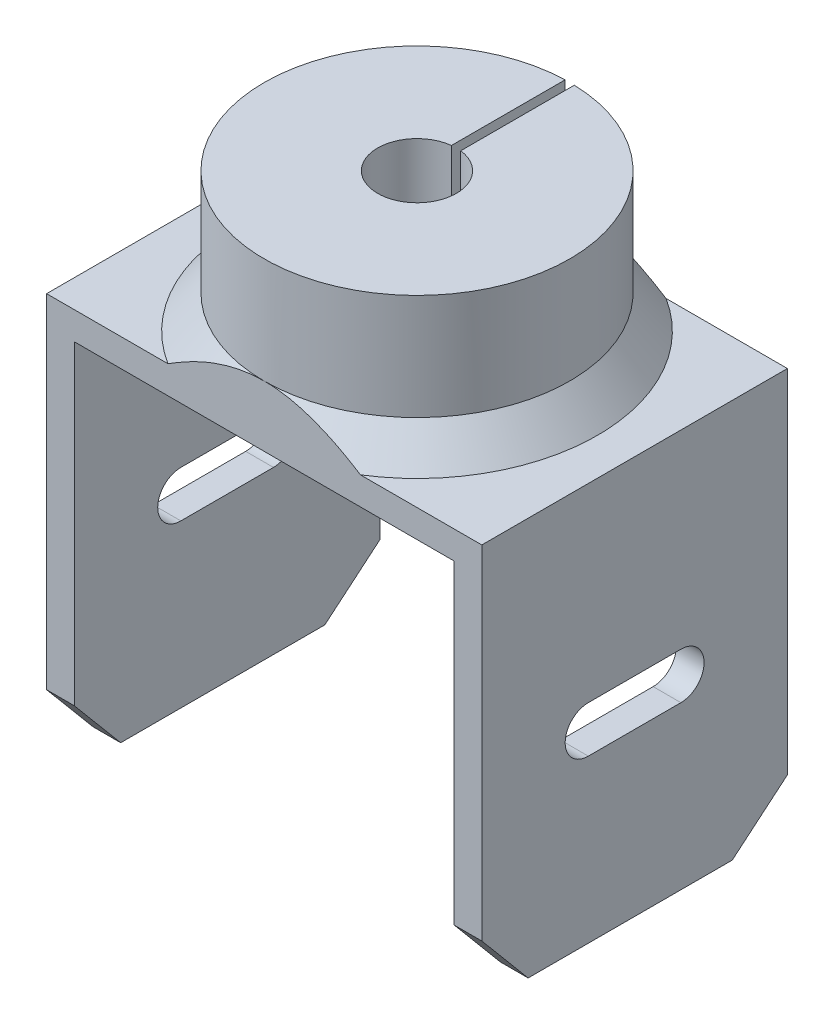
ISO-10303-21;
HEADER;
FILE_DESCRIPTION(('STEP AP214'),'2;1');
FILE_NAME('part.step','',(''),(''),'','','');
FILE_SCHEMA(('AUTOMOTIVE_DESIGN { 1 0 10303 214 1 1 1 1 }'));
ENDSEC;
DATA;
#1=APPLICATION_CONTEXT('core data for automotive mechanical design processes');
#2=APPLICATION_PROTOCOL_DEFINITION('international standard','automotive_design',2000,#1);
#3=PRODUCT_CONTEXT('',#1,'mechanical');
#4=PRODUCT('Part','Part','',(#3));
#5=PRODUCT_RELATED_PRODUCT_CATEGORY('part','',(#4));
#6=PRODUCT_DEFINITION_FORMATION('','',#4);
#7=PRODUCT_DEFINITION_CONTEXT('part definition',#1,'design');
#8=PRODUCT_DEFINITION('design','',#6,#7);
#9=PRODUCT_DEFINITION_SHAPE('','',#8);
#10=(LENGTH_UNIT() NAMED_UNIT(*) SI_UNIT(.MILLI.,.METRE.));
#11=(NAMED_UNIT(*) PLANE_ANGLE_UNIT() SI_UNIT($,.RADIAN.));
#12=(NAMED_UNIT(*) SI_UNIT($,.STERADIAN.) SOLID_ANGLE_UNIT());
#13=UNCERTAINTY_MEASURE_WITH_UNIT(LENGTH_MEASURE(1.E-05),#10,'distance_accuracy_value','');
#14=(GEOMETRIC_REPRESENTATION_CONTEXT(3) GLOBAL_UNCERTAINTY_ASSIGNED_CONTEXT((#13)) GLOBAL_UNIT_ASSIGNED_CONTEXT((#10,
#11,#12)) REPRESENTATION_CONTEXT('',''));
#15=CARTESIAN_POINT('',(0.,0.,0.));
#16=DIRECTION('',(0.,0.,1.));
#17=DIRECTION('',(1.,0.,0.));
#18=AXIS2_PLACEMENT_3D('',#15,#16,#17);
#19=CARTESIAN_POINT('',(20.5,46.5752607777827,16.5));
#20=DIRECTION('',(0.,-1.,0.));
#21=DIRECTION('',(0.,0.,-1.));
#22=AXIS2_PLACEMENT_3D('',#19,#20,#21);
#23=CONICAL_SURFACE('',#22,16.5,0.698131700797727);
#24=CARTESIAN_POINT('',(20.,31.1235858784582,-12.9612521534924));
#25=CARTESIAN_POINT('',(20.,32.4082386581928,-11.8831437303844));
#26=CARTESIAN_POINT('',(20.,33.6928844605559,-10.8050269927722));
#27=CARTESIAN_POINT('',(20.,36.2621518242112,-8.64876480954999));
#28=CARTESIAN_POINT('',(20.,37.5467733855051,-7.5706193639419));
#29=CARTESIAN_POINT('',(20.,40.1159818837572,-5.41428776711653));
#30=CARTESIAN_POINT('',(20.,41.4005688207225,-4.33610161590785));
#31=CARTESIAN_POINT('',(20.,43.9696882564792,-2.1796642860111));
#32=CARTESIAN_POINT('',(20.,45.2542207552669,-1.10141310731876));
#33=CARTESIAN_POINT('',(20.,47.8231957486794,1.0551975488786));
#34=CARTESIAN_POINT('',(20.,49.1076382432667,2.13355702642822));
#35=CARTESIAN_POINT('',(20.,51.034169306314,3.75125399468718));
#36=CARTESIAN_POINT('',(20.,51.6763241504041,4.2905125558501));
#37=CARTESIAN_POINT('',(20.,52.9605675644327,5.36910868972706));
#38=CARTESIAN_POINT('',(20.,53.6026561343662,5.90844626244701));
#39=CARTESIAN_POINT('',(20.,54.8867304456449,6.98724464832452));
#40=CARTESIAN_POINT('',(20.,55.5287161869234,7.52670546156154));
#41=CARTESIAN_POINT('',(20.,56.8125167209691,8.60583022162086));
#42=CARTESIAN_POINT('',(20.,57.4543315137728,9.14549416839975));
#43=CARTESIAN_POINT('',(20.,58.4168092218042,9.95528129906022));
#44=CARTESIAN_POINT('',(20.,58.7375945246768,10.2252590015758));
#45=CARTESIAN_POINT('',(20.,59.3790417376693,10.7653608434587));
#46=CARTESIAN_POINT('',(20.,59.6997036478092,11.0354849828024));
#47=CARTESIAN_POINT('',(20.,60.3408473156922,11.575947628918));
#48=CARTESIAN_POINT('',(20.,60.6613290732863,11.8462861358666));
#49=CARTESIAN_POINT('',(20.,61.3019644169624,12.3873520228227));
#50=CARTESIAN_POINT('',(20.,61.6221180028517,12.6580794030584));
#51=CARTESIAN_POINT('',(20.,61.9420334373806,12.9290884254426));
#52=B_SPLINE_CURVE_WITH_KNOTS('',3,(#24,#25,#26,#27,#28,#29,#30,#31,#32,#33,#34,#35,#36,#37,#38,
#39,#40,#41,#42,#43,#44,#45,#46,#47,#48,#49,#50,#51),.UNSPECIFIED.,.F.,.F.,(4,2,2,2,2,2,2,2,2,2,
2,2,2,4),(0.,5.03128759179536,10.0625748440544,15.09386103754,20.1251475613957,25.1564361650056,
27.6720799669897,30.1877239570945,32.7033695736349,35.2190146528186,36.4768383461005,
37.7346618352053,38.9924863621584,40.250311627848),.UNSPECIFIED.);
#53=CARTESIAN_POINT('',(20.0000000000008,46.5662344131679,0.));
#54=VERTEX_POINT('',#53);
#55=CARTESIAN_POINT('',(20.,46.5752607777827,0.00757749752935572));
#56=VERTEX_POINT('',#55);
#57=EDGE_CURVE('E417',#54,#56,#52,.T.);
#58=ORIENTED_EDGE('',*,*,#57,.F.);
#59=CARTESIAN_POINT('',(10.1076951545867,43.,0.));
#60=CARTESIAN_POINT('',(10.3713029475647,43.1674025231381,0.));
#61=CARTESIAN_POINT('',(10.6369767958303,43.3316015660541,0.));
#62=CARTESIAN_POINT('',(11.1728436984879,43.6526508913293,0.));
#63=CARTESIAN_POINT('',(11.4430382351766,43.8094986965571,0.));
#64=CARTESIAN_POINT('',(11.9894137016226,44.1154938605991,0.));
#65=CARTESIAN_POINT('',(12.2656164811726,44.26460240082,0.));
#66=CARTESIAN_POINT('',(12.8230054590707,44.553102300888,0.));
#67=CARTESIAN_POINT('',(13.1041911530497,44.6924946372394,0.));
#68=CARTESIAN_POINT('',(13.9383858209299,45.0860198222011,0.));
#69=CARTESIAN_POINT('',(14.4987060249486,45.3249868541375,0.));
#70=CARTESIAN_POINT('',(15.6384232778204,45.7495789928983,0.));
#71=CARTESIAN_POINT('',(16.2177802751166,45.9353089833988,0.));
#72=CARTESIAN_POINT('',(17.1045913482349,46.1662485176849,0.));
#73=CARTESIAN_POINT('',(17.4058204063377,46.2356695361382,0.));
#74=CARTESIAN_POINT('',(18.0119671429305,46.3561486345492,0.));
#75=CARTESIAN_POINT('',(18.3168848188276,46.4072067274141,0.));
#76=CARTESIAN_POINT('',(18.9340202305861,46.4903266759053,0.));
#77=CARTESIAN_POINT('',(19.2462787295583,46.5220906573194,0.));
#78=CARTESIAN_POINT('',(19.7157712090069,46.5539455814985,0.));
#79=CARTESIAN_POINT('',(19.8725019728392,46.561932073572,0.));
#80=CARTESIAN_POINT('',(20.1861510318667,46.5725919239759,0.));
#81=CARTESIAN_POINT('',(20.3430693352848,46.5752650400884,0.));
#82=CARTESIAN_POINT('',(20.5,46.5752607777827,0.));
#83=B_SPLINE_CURVE_WITH_KNOTS('',3,(#59,#60,#61,#62,#63,#64,#65,#66,#67,#68,#69,#70,#71,#72,#73,
#74,#75,#76,#77,#78,#79,#80,#81,#82),.UNSPECIFIED.,.F.,.F.,(4,2,2,2,2,2,2,2,2,2,2,4),(0.,
0.936825624137657,1.87396469166485,2.81542255533145,3.756785663154,5.5821015813017,
7.40379628407125,8.33068705331386,9.2575771710448,10.1984357654159,10.6691593428868,
11.1399043784784),.UNSPECIFIED.);
#84=CARTESIAN_POINT('',(10.1076951545867,43.,0.));
#85=VERTEX_POINT('',#84);
#86=EDGE_CURVE('E389',#85,#54,#83,.T.);
#87=ORIENTED_EDGE('',*,*,#86,.F.);
#88=CARTESIAN_POINT('',(20.5,43.,16.5));
#89=DIRECTION('',(0.,-1.,0.));
#90=DIRECTION('',(0.,0.,-1.));
#91=AXIS2_PLACEMENT_3D('',#88,#89,#90);
#92=CIRCLE('',#91,19.5);
#93=CARTESIAN_POINT('',(10.1076951545867,43.,33.));
#94=VERTEX_POINT('',#93);
#95=EDGE_CURVE('E377',#94,#85,#92,.T.);
#96=ORIENTED_EDGE('',*,*,#95,.F.);
#97=CARTESIAN_POINT('',(20.5,46.5752607777827,33.));
#98=CARTESIAN_POINT('',(20.284187533117,46.575283673132,33.));
#99=CARTESIAN_POINT('',(20.0683831516863,46.5702153896589,33.));
#100=CARTESIAN_POINT('',(19.6372729182324,46.5500666405771,33.));
#101=CARTESIAN_POINT('',(19.4219669976472,46.534987645521,33.));
#102=CARTESIAN_POINT('',(18.99265426695,46.4950231050673,33.));
#103=CARTESIAN_POINT('',(18.7786458279619,46.4701550378579,33.));
#104=CARTESIAN_POINT('',(18.3519552062854,46.4109374446163,33.));
#105=CARTESIAN_POINT('',(18.1392730600473,46.3765876591646,33.));
#106=CARTESIAN_POINT('',(17.5115826635059,46.2613366966163,33.));
#107=CARTESIAN_POINT('',(17.0989011397188,46.1674550195782,33.));
#108=CARTESIAN_POINT('',(16.2819239862643,45.9484414137886,33.));
#109=CARTESIAN_POINT('',(15.8776314486593,45.8232981765294,33.));
#110=CARTESIAN_POINT('',(15.0096600170661,45.5221084576806,33.));
#111=CARTESIAN_POINT('',(14.5477426058939,45.3410073492915,33.));
#112=CARTESIAN_POINT('',(13.637034951159,44.9481285605995,33.));
#113=CARTESIAN_POINT('',(13.1882517450428,44.7363347838778,33.));
#114=CARTESIAN_POINT('',(12.2931774421302,44.2826407364062,33.));
#115=CARTESIAN_POINT('',(11.8471832168154,44.0401581709657,33.));
#116=CARTESIAN_POINT('',(11.1877662131576,43.6608648180069,33.));
#117=CARTESIAN_POINT('',(10.9697364722435,43.5319542689151,33.));
#118=CARTESIAN_POINT('',(10.5365873757278,43.2694043515296,33.));
#119=CARTESIAN_POINT('',(10.321467570923,43.1357657248892,33.));
#120=CARTESIAN_POINT('',(10.1076951545867,43.,33.));
#121=B_SPLINE_CURVE_WITH_KNOTS('',3,(#97,#98,#99,#100,#101,#102,#103,#104,#105,#106,#107,#108,
#109,#110,#111,#112,#113,#114,#115,#116,#117,#118,#119,#120),.UNSPECIFIED.,.F.,.F.,(4,2,2,2,2,2,
2,2,2,2,2,4),(0.,0.647364404019486,1.29463373259782,1.9407525791622,2.5868891052842,
3.85504288283706,5.12365606633128,6.61071477164996,8.09855618925469,9.62075575901222,
10.3805725269616,11.1402706328046),.UNSPECIFIED.);
#122=CARTESIAN_POINT('',(20.5,46.5752607777827,33.));
#123=VERTEX_POINT('',#122);
#124=EDGE_CURVE('E382',#123,#94,#121,.T.);
#125=ORIENTED_EDGE('',*,*,#124,.F.);
#126=CARTESIAN_POINT('',(20.5,46.5752607777827,16.5));
#127=DIRECTION('',(0.,-1.,0.));
#128=DIRECTION('',(0.,0.,-1.));
#129=AXIS2_PLACEMENT_3D('',#126,#127,#128);
#130=CIRCLE('',#129,16.5);
#131=EDGE_CURVE('E375',#56,#123,#130,.F.);
#132=ORIENTED_EDGE('',*,*,#131,.F.);
#133=EDGE_LOOP('',(#58,#87,#96,#125,#132));
#134=FACE_BOUND('',#133,.T.);
#135=ADVANCED_FACE('F33',(#134),#23,.T.);
#136=CARTESIAN_POINT('',(-3.,43.,33.));
#137=DIRECTION('',(0.,-1.,0.));
#138=DIRECTION('',(0.,0.,-1.));
#139=AXIS2_PLACEMENT_3D('',#136,#137,#138);
#140=PLANE('',#139);
#141=DIRECTION('',(-1.,0.,0.));
#142=VECTOR('',#141,1.);
#143=CARTESIAN_POINT('',(-3.,43.,0.));
#144=LINE('',#143,#142);
#145=CARTESIAN_POINT('',(44.,43.,0.));
#146=VERTEX_POINT('',#145);
#147=CARTESIAN_POINT('',(30.8923048454133,43.,0.));
#148=VERTEX_POINT('',#147);
#149=EDGE_CURVE('E346',#146,#148,#144,.T.);
#150=ORIENTED_EDGE('',*,*,#149,.T.);
#151=CARTESIAN_POINT('',(20.5,43.,16.5));
#152=DIRECTION('',(0.,-1.,0.));
#153=DIRECTION('',(0.,0.,-1.));
#154=AXIS2_PLACEMENT_3D('',#151,#152,#153);
#155=CIRCLE('',#154,19.5);
#156=CARTESIAN_POINT('',(30.8923048454133,43.,33.));
#157=VERTEX_POINT('',#156);
#158=EDGE_CURVE('E380',#148,#157,#155,.T.);
#159=ORIENTED_EDGE('',*,*,#158,.T.);
#160=DIRECTION('',(-1.,0.,0.));
#161=VECTOR('',#160,1.);
#162=CARTESIAN_POINT('',(-3.,43.,33.));
#163=LINE('',#162,#161);
#164=CARTESIAN_POINT('',(44.,43.,33.));
#165=VERTEX_POINT('',#164);
#166=EDGE_CURVE('E330',#165,#157,#163,.T.);
#167=ORIENTED_EDGE('',*,*,#166,.F.);
#168=DIRECTION('',(0.,0.,-1.));
#169=VECTOR('',#168,1.);
#170=CARTESIAN_POINT('',(44.,43.,33.));
#171=LINE('',#170,#169);
#172=EDGE_CURVE('E354',#165,#146,#171,.T.);
#173=ORIENTED_EDGE('',*,*,#172,.T.);
#174=EDGE_LOOP('',(#150,#159,#167,#173));
#175=FACE_BOUND('',#174,.T.);
#176=ADVANCED_FACE('F482',(#175),#140,.F.);
#177=CARTESIAN_POINT('',(-3.,0.,33.));
#178=DIRECTION('',(0.,1.,0.));
#179=DIRECTION('',(0.,0.,1.));
#180=AXIS2_PLACEMENT_3D('',#177,#178,#179);
#181=PLANE('',#180);
#182=DIRECTION('',(0.,0.,-1.));
#183=VECTOR('',#182,1.);
#184=CARTESIAN_POINT('',(0.,0.,33.));
#185=LINE('',#184,#183);
#186=CARTESIAN_POINT('',(0.,0.,28.));
#187=VERTEX_POINT('',#186);
#188=CARTESIAN_POINT('',(0.,0.,5.95876796297104));
#189=VERTEX_POINT('',#188);
#190=EDGE_CURVE('E369',#187,#189,#185,.T.);
#191=ORIENTED_EDGE('',*,*,#190,.F.);
#192=DIRECTION('',(-1.,0.,0.));
#193=VECTOR('',#192,1.);
#194=CARTESIAN_POINT('',(-3.,0.,28.));
#195=LINE('',#194,#193);
#196=CARTESIAN_POINT('',(-3.,0.,28.));
#197=VERTEX_POINT('',#196);
#198=EDGE_CURVE('E54',#187,#197,#195,.T.);
#199=ORIENTED_EDGE('',*,*,#198,.T.);
#200=DIRECTION('',(0.,0.,-1.));
#201=VECTOR('',#200,1.);
#202=CARTESIAN_POINT('',(-3.,0.,33.));
#203=LINE('',#202,#201);
#204=CARTESIAN_POINT('',(-3.,0.,5.95876796297104));
#205=VERTEX_POINT('',#204);
#206=EDGE_CURVE('E336',#197,#205,#203,.T.);
#207=ORIENTED_EDGE('',*,*,#206,.T.);
#208=DIRECTION('',(1.,0.,0.));
#209=VECTOR('',#208,1.);
#210=CARTESIAN_POINT('',(-3.,0.,5.95876796297104));
#211=LINE('',#210,#209);
#212=EDGE_CURVE('E545',#205,#189,#211,.T.);
#213=ORIENTED_EDGE('',*,*,#212,.T.);
#214=EDGE_LOOP('',(#191,#199,#207,#213));
#215=FACE_BOUND('',#214,.T.);
#216=ADVANCED_FACE('F487',(#215),#181,.F.);
#217=CARTESIAN_POINT('',(0.,0.,33.));
#218=DIRECTION('',(-1.,0.,0.));
#219=DIRECTION('',(0.,0.,1.));
#220=AXIS2_PLACEMENT_3D('',#217,#218,#219);
#221=PLANE('',#220);
#222=DIRECTION('',(0.,0.,1.));
#223=VECTOR('',#222,1.);
#224=CARTESIAN_POINT('',(0.,17.5,33.));
#225=LINE('',#224,#223);
#226=CARTESIAN_POINT('',(0.,17.5,11.5));
#227=VERTEX_POINT('',#226);
#228=CARTESIAN_POINT('',(0.,17.5,21.5));
#229=VERTEX_POINT('',#228);
#230=EDGE_CURVE('E297',#227,#229,#225,.T.);
#231=ORIENTED_EDGE('',*,*,#230,.T.);
#232=CARTESIAN_POINT('',(0.,20.,21.5));
#233=DIRECTION('',(-1.,0.,0.));
#234=DIRECTION('',(0.,0.,1.));
#235=AXIS2_PLACEMENT_3D('',#232,#233,#234);
#236=CIRCLE('',#235,2.5);
#237=CARTESIAN_POINT('',(0.,22.5,21.5));
#238=VERTEX_POINT('',#237);
#239=EDGE_CURVE('E315',#229,#238,#236,.T.);
#240=ORIENTED_EDGE('',*,*,#239,.T.);
#241=DIRECTION('',(0.,0.,-1.));
#242=VECTOR('',#241,1.);
#243=CARTESIAN_POINT('',(0.,22.5,33.));
#244=LINE('',#243,#242);
#245=CARTESIAN_POINT('',(0.,22.5,11.5));
#246=VERTEX_POINT('',#245);
#247=EDGE_CURVE('E309',#238,#246,#244,.T.);
#248=ORIENTED_EDGE('',*,*,#247,.T.);
#249=CARTESIAN_POINT('',(0.,20.,11.5));
#250=DIRECTION('',(-1.,0.,0.));
#251=DIRECTION('',(0.,0.,1.));
#252=AXIS2_PLACEMENT_3D('',#249,#250,#251);
#253=CIRCLE('',#252,2.49999999999999);
#254=EDGE_CURVE('E303',#246,#227,#253,.T.);
#255=ORIENTED_EDGE('',*,*,#254,.T.);
#256=EDGE_LOOP('',(#231,#240,#248,#255));
#257=FACE_BOUND('',#256,.T.);
#258=DIRECTION('',(0.,1.,0.));
#259=VECTOR('',#258,1.);
#260=CARTESIAN_POINT('',(0.,0.,33.));
#261=LINE('',#260,#259);
#262=CARTESIAN_POINT('',(0.,5.95876796297105,33.));
#263=VERTEX_POINT('',#262);
#264=CARTESIAN_POINT('',(0.,40.,33.));
#265=VERTEX_POINT('',#264);
#266=EDGE_CURVE('E319',#263,#265,#261,.T.);
#267=ORIENTED_EDGE('',*,*,#266,.F.);
#268=DIRECTION('',(0.,-0.766044443118977,-0.64278760968654));
#269=VECTOR('',#268,1.);
#270=CARTESIAN_POINT('',(0.,5.95876796297105,33.));
#271=LINE('',#270,#269);
#272=EDGE_CURVE('E519',#263,#187,#271,.T.);
#273=ORIENTED_EDGE('',*,*,#272,.T.);
#274=ORIENTED_EDGE('',*,*,#190,.T.);
#275=DIRECTION('',(0.,-0.64278760968654,0.766044443118977));
#276=VECTOR('',#275,1.);
#277=CARTESIAN_POINT('',(0.,0.,5.95876796297104));
#278=LINE('',#277,#276);
#279=CARTESIAN_POINT('',(0.,5.,0.));
#280=VERTEX_POINT('',#279);
#281=EDGE_CURVE('E542',#189,#280,#278,.F.);
#282=ORIENTED_EDGE('',*,*,#281,.T.);
#283=DIRECTION('',(0.,1.,0.));
#284=VECTOR('',#283,1.);
#285=CARTESIAN_POINT('',(0.,0.,0.));
#286=LINE('',#285,#284);
#287=CARTESIAN_POINT('',(0.,40.,0.));
#288=VERTEX_POINT('',#287);
#289=EDGE_CURVE('E318',#280,#288,#286,.T.);
#290=ORIENTED_EDGE('',*,*,#289,.T.);
#291=DIRECTION('',(0.,0.,-1.));
#292=VECTOR('',#291,1.);
#293=CARTESIAN_POINT('',(0.,40.,33.));
#294=LINE('',#293,#292);
#295=EDGE_CURVE('E366',#265,#288,#294,.T.);
#296=ORIENTED_EDGE('',*,*,#295,.F.);
#297=EDGE_LOOP('',(#267,#273,#274,#282,#290,#296));
#298=FACE_BOUND('',#297,.T.);
#299=ADVANCED_FACE('F551',(#257,#298),#221,.F.);
#300=CARTESIAN_POINT('',(0.,40.,33.));
#301=DIRECTION('',(0.,1.,0.));
#302=DIRECTION('',(0.,0.,1.));
#303=AXIS2_PLACEMENT_3D('',#300,#301,#302);
#304=PLANE('',#303);
#305=DIRECTION('',(1.,0.,0.));
#306=VECTOR('',#305,1.);
#307=CARTESIAN_POINT('',(0.,40.,0.));
#308=LINE('',#307,#306);
#309=CARTESIAN_POINT('',(41.,40.,0.));
#310=VERTEX_POINT('',#309);
#311=EDGE_CURVE('E338',#288,#310,#308,.T.);
#312=ORIENTED_EDGE('',*,*,#311,.T.);
#313=DIRECTION('',(0.,0.,-1.));
#314=VECTOR('',#313,1.);
#315=CARTESIAN_POINT('',(41.,40.,33.));
#316=LINE('',#315,#314);
#317=CARTESIAN_POINT('',(41.,40.,33.));
#318=VERTEX_POINT('',#317);
#319=EDGE_CURVE('E363',#318,#310,#316,.T.);
#320=ORIENTED_EDGE('',*,*,#319,.F.);
#321=DIRECTION('',(1.,0.,0.));
#322=VECTOR('',#321,1.);
#323=CARTESIAN_POINT('',(0.,40.,33.));
#324=LINE('',#323,#322);
#325=EDGE_CURVE('E321',#265,#318,#324,.T.);
#326=ORIENTED_EDGE('',*,*,#325,.F.);
#327=ORIENTED_EDGE('',*,*,#295,.T.);
#328=EDGE_LOOP('',(#312,#320,#326,#327));
#329=FACE_BOUND('',#328,.T.);
#330=ADVANCED_FACE('F558',(#329),#304,.F.);
#331=CARTESIAN_POINT('',(41.,40.,33.));
#332=DIRECTION('',(1.,0.,0.));
#333=DIRECTION('',(0.,0.,-1.));
#334=AXIS2_PLACEMENT_3D('',#331,#332,#333);
#335=PLANE('',#334);
#336=DIRECTION('',(0.,0.,1.));
#337=VECTOR('',#336,1.);
#338=CARTESIAN_POINT('',(41.,22.5,33.));
#339=LINE('',#338,#337);
#340=CARTESIAN_POINT('',(41.,22.5,11.5));
#341=VERTEX_POINT('',#340);
#342=CARTESIAN_POINT('',(41.,22.5,21.5));
#343=VERTEX_POINT('',#342);
#344=EDGE_CURVE('E306',#341,#343,#339,.T.);
#345=ORIENTED_EDGE('',*,*,#344,.T.);
#346=CARTESIAN_POINT('',(41.,20.,21.5));
#347=DIRECTION('',(1.,0.,0.));
#348=DIRECTION('',(0.,0.,-1.));
#349=AXIS2_PLACEMENT_3D('',#346,#347,#348);
#350=CIRCLE('',#349,2.5);
#351=CARTESIAN_POINT('',(41.,17.5,21.5));
#352=VERTEX_POINT('',#351);
#353=EDGE_CURVE('E312',#343,#352,#350,.T.);
#354=ORIENTED_EDGE('',*,*,#353,.T.);
#355=DIRECTION('',(0.,0.,-1.));
#356=VECTOR('',#355,1.);
#357=CARTESIAN_POINT('',(41.,17.5,33.));
#358=LINE('',#357,#356);
#359=CARTESIAN_POINT('',(41.,17.5,11.5));
#360=VERTEX_POINT('',#359);
#361=EDGE_CURVE('E283',#352,#360,#358,.T.);
#362=ORIENTED_EDGE('',*,*,#361,.T.);
#363=CARTESIAN_POINT('',(41.,20.,11.5));
#364=DIRECTION('',(1.,0.,0.));
#365=DIRECTION('',(0.,0.,-1.));
#366=AXIS2_PLACEMENT_3D('',#363,#364,#365);
#367=CIRCLE('',#366,2.49999999999999);
#368=EDGE_CURVE('E300',#360,#341,#367,.T.);
#369=ORIENTED_EDGE('',*,*,#368,.T.);
#370=EDGE_LOOP('',(#345,#354,#362,#369));
#371=FACE_BOUND('',#370,.T.);
#372=DIRECTION('',(0.,0.,-1.));
#373=VECTOR('',#372,1.);
#374=CARTESIAN_POINT('',(41.,0.,33.));
#375=LINE('',#374,#373);
#376=CARTESIAN_POINT('',(41.,0.,28.));
#377=VERTEX_POINT('',#376);
#378=CARTESIAN_POINT('',(41.,0.,5.95876796297104));
#379=VERTEX_POINT('',#378);
#380=EDGE_CURVE('E360',#377,#379,#375,.T.);
#381=ORIENTED_EDGE('',*,*,#380,.F.);
#382=DIRECTION('',(0.,0.766044443118977,0.64278760968654));
#383=VECTOR('',#382,1.);
#384=CARTESIAN_POINT('',(41.,5.95876796297105,33.));
#385=LINE('',#384,#383);
#386=CARTESIAN_POINT('',(41.,5.95876796297105,33.));
#387=VERTEX_POINT('',#386);
#388=EDGE_CURVE('E536',#377,#387,#385,.T.);
#389=ORIENTED_EDGE('',*,*,#388,.T.);
#390=DIRECTION('',(0.,-1.,0.));
#391=VECTOR('',#390,1.);
#392=CARTESIAN_POINT('',(41.,40.,33.));
#393=LINE('',#392,#391);
#394=EDGE_CURVE('E324',#318,#387,#393,.T.);
#395=ORIENTED_EDGE('',*,*,#394,.F.);
#396=ORIENTED_EDGE('',*,*,#319,.T.);
#397=DIRECTION('',(0.,-1.,0.));
#398=VECTOR('',#397,1.);
#399=CARTESIAN_POINT('',(41.,40.,0.));
#400=LINE('',#399,#398);
#401=CARTESIAN_POINT('',(41.,5.,0.));
#402=VERTEX_POINT('',#401);
#403=EDGE_CURVE('E340',#310,#402,#400,.T.);
#404=ORIENTED_EDGE('',*,*,#403,.T.);
#405=DIRECTION('',(0.,0.64278760968654,-0.766044443118977));
#406=VECTOR('',#405,1.);
#407=CARTESIAN_POINT('',(41.,0.,5.95876796297104));
#408=LINE('',#407,#406);
#409=EDGE_CURVE('E534',#402,#379,#408,.F.);
#410=ORIENTED_EDGE('',*,*,#409,.T.);
#411=EDGE_LOOP('',(#381,#389,#395,#396,#404,#410));
#412=FACE_BOUND('',#411,.T.);
#413=ADVANCED_FACE('F563',(#371,#412),#335,.F.);
#414=CARTESIAN_POINT('',(41.,0.,33.));
#415=DIRECTION('',(0.,1.,0.));
#416=DIRECTION('',(0.,0.,1.));
#417=AXIS2_PLACEMENT_3D('',#414,#415,#416);
#418=PLANE('',#417);
#419=DIRECTION('',(0.,0.,-1.));
#420=VECTOR('',#419,1.);
#421=CARTESIAN_POINT('',(44.,0.,33.));
#422=LINE('',#421,#420);
#423=CARTESIAN_POINT('',(44.,0.,28.));
#424=VERTEX_POINT('',#423);
#425=CARTESIAN_POINT('',(44.,0.,5.95876796297104));
#426=VERTEX_POINT('',#425);
#427=EDGE_CURVE('E357',#424,#426,#422,.T.);
#428=ORIENTED_EDGE('',*,*,#427,.F.);
#429=DIRECTION('',(-1.,0.,0.));
#430=VECTOR('',#429,1.);
#431=CARTESIAN_POINT('',(41.,0.,28.));
#432=LINE('',#431,#430);
#433=EDGE_CURVE('E532',#424,#377,#432,.T.);
#434=ORIENTED_EDGE('',*,*,#433,.T.);
#435=ORIENTED_EDGE('',*,*,#380,.T.);
#436=DIRECTION('',(1.,0.,0.));
#437=VECTOR('',#436,1.);
#438=CARTESIAN_POINT('',(41.,0.,5.95876796297104));
#439=LINE('',#438,#437);
#440=EDGE_CURVE('E529',#379,#426,#439,.T.);
#441=ORIENTED_EDGE('',*,*,#440,.T.);
#442=EDGE_LOOP('',(#428,#434,#435,#441));
#443=FACE_BOUND('',#442,.T.);
#444=ADVANCED_FACE('F571',(#443),#418,.F.);
#445=CARTESIAN_POINT('',(44.,43.,33.));
#446=DIRECTION('',(-1.,0.,0.));
#447=DIRECTION('',(0.,0.,1.));
#448=AXIS2_PLACEMENT_3D('',#445,#446,#447);
#449=PLANE('',#448);
#450=DIRECTION('',(0.,0.,-1.));
#451=VECTOR('',#450,1.);
#452=CARTESIAN_POINT('',(44.,17.5,21.5));
#453=LINE('',#452,#451);
#454=CARTESIAN_POINT('',(44.,17.5,21.5));
#455=VERTEX_POINT('',#454);
#456=CARTESIAN_POINT('',(44.,17.5,11.5));
#457=VERTEX_POINT('',#456);
#458=EDGE_CURVE('E258',#455,#457,#453,.T.);
#459=ORIENTED_EDGE('',*,*,#458,.F.);
#460=CARTESIAN_POINT('',(44.,20.,21.5));
#461=DIRECTION('',(1.,0.,0.));
#462=DIRECTION('',(0.,0.,-1.));
#463=AXIS2_PLACEMENT_3D('',#460,#461,#462);
#464=CIRCLE('',#463,2.5);
#465=CARTESIAN_POINT('',(44.,22.5,21.5));
#466=VERTEX_POINT('',#465);
#467=EDGE_CURVE('E256',#466,#455,#464,.T.);
#468=ORIENTED_EDGE('',*,*,#467,.F.);
#469=DIRECTION('',(0.,0.,1.));
#470=VECTOR('',#469,1.);
#471=CARTESIAN_POINT('',(44.,22.5,21.5));
#472=LINE('',#471,#470);
#473=CARTESIAN_POINT('',(44.,22.5,11.5));
#474=VERTEX_POINT('',#473);
#475=EDGE_CURVE('E264',#474,#466,#472,.T.);
#476=ORIENTED_EDGE('',*,*,#475,.F.);
#477=CARTESIAN_POINT('',(44.,20.,11.5));
#478=DIRECTION('',(1.,0.,0.));
#479=DIRECTION('',(0.,0.,-1.));
#480=AXIS2_PLACEMENT_3D('',#477,#478,#479);
#481=CIRCLE('',#480,2.49999999999999);
#482=EDGE_CURVE('E261',#457,#474,#481,.T.);
#483=ORIENTED_EDGE('',*,*,#482,.F.);
#484=EDGE_LOOP('',(#459,#468,#476,#483));
#485=FACE_BOUND('',#484,.T.);
#486=DIRECTION('',(0.,1.,0.));
#487=VECTOR('',#486,1.);
#488=CARTESIAN_POINT('',(44.,43.,33.));
#489=LINE('',#488,#487);
#490=CARTESIAN_POINT('',(44.,5.95876796297105,33.));
#491=VERTEX_POINT('',#490);
#492=EDGE_CURVE('E327',#491,#165,#489,.T.);
#493=ORIENTED_EDGE('',*,*,#492,.F.);
#494=DIRECTION('',(0.,-0.766044443118977,-0.64278760968654));
#495=VECTOR('',#494,1.);
#496=CARTESIAN_POINT('',(44.,5.95876796297105,33.));
#497=LINE('',#496,#495);
#498=EDGE_CURVE('E525',#491,#424,#497,.T.);
#499=ORIENTED_EDGE('',*,*,#498,.T.);
#500=ORIENTED_EDGE('',*,*,#427,.T.);
#501=DIRECTION('',(0.,-0.64278760968654,0.766044443118977));
#502=VECTOR('',#501,1.);
#503=CARTESIAN_POINT('',(44.,0.,5.95876796297104));
#504=LINE('',#503,#502);
#505=CARTESIAN_POINT('',(44.,5.,0.));
#506=VERTEX_POINT('',#505);
#507=EDGE_CURVE('E522',#426,#506,#504,.F.);
#508=ORIENTED_EDGE('',*,*,#507,.T.);
#509=DIRECTION('',(0.,1.,0.));
#510=VECTOR('',#509,1.);
#511=CARTESIAN_POINT('',(44.,43.,0.));
#512=LINE('',#511,#510);
#513=EDGE_CURVE('E343',#506,#146,#512,.T.);
#514=ORIENTED_EDGE('',*,*,#513,.T.);
#515=ORIENTED_EDGE('',*,*,#172,.F.);
#516=EDGE_LOOP('',(#493,#499,#500,#508,#514,#515));
#517=FACE_BOUND('',#516,.T.);
#518=ADVANCED_FACE('F569',(#485,#517),#449,.F.);
#519=CARTESIAN_POINT('',(-3.,43.,33.));
#520=VERTEX_POINT('',#519);
#521=EDGE_CURVE('E329',#94,#520,#163,.T.);
#522=ORIENTED_EDGE('',*,*,#521,.F.);
#523=ORIENTED_EDGE('',*,*,#95,.T.);
#524=CARTESIAN_POINT('',(-3.,43.,0.));
#525=VERTEX_POINT('',#524);
#526=EDGE_CURVE('E345',#85,#525,#144,.T.);
#527=ORIENTED_EDGE('',*,*,#526,.T.);
#528=DIRECTION('',(0.,0.,-1.));
#529=VECTOR('',#528,1.);
#530=CARTESIAN_POINT('',(-3.,43.,33.));
#531=LINE('',#530,#529);
#532=EDGE_CURVE('E351',#520,#525,#531,.T.);
#533=ORIENTED_EDGE('',*,*,#532,.F.);
#534=EDGE_LOOP('',(#522,#523,#527,#533));
#535=FACE_BOUND('',#534,.T.);
#536=ADVANCED_FACE('F490',(#535),#140,.F.);
#537=CARTESIAN_POINT('',(-3.,0.,33.));
#538=DIRECTION('',(1.,0.,0.));
#539=DIRECTION('',(0.,0.,-1.));
#540=AXIS2_PLACEMENT_3D('',#537,#538,#539);
#541=PLANE('',#540);
#542=DIRECTION('',(0.,0.,1.));
#543=VECTOR('',#542,1.);
#544=CARTESIAN_POINT('',(-3.,22.5,21.5));
#545=LINE('',#544,#543);
#546=CARTESIAN_POINT('',(-3.,22.5,11.5));
#547=VERTEX_POINT('',#546);
#548=CARTESIAN_POINT('',(-3.,22.5,21.5));
#549=VERTEX_POINT('',#548);
#550=EDGE_CURVE('E276',#547,#549,#545,.T.);
#551=ORIENTED_EDGE('',*,*,#550,.T.);
#552=CARTESIAN_POINT('',(-3.,20.,21.5));
#553=DIRECTION('',(1.,0.,0.));
#554=DIRECTION('',(0.,0.,-1.));
#555=AXIS2_PLACEMENT_3D('',#552,#553,#554);
#556=CIRCLE('',#555,2.5);
#557=CARTESIAN_POINT('',(-3.,17.5,21.5));
#558=VERTEX_POINT('',#557);
#559=EDGE_CURVE('E267',#549,#558,#556,.T.);
#560=ORIENTED_EDGE('',*,*,#559,.T.);
#561=DIRECTION('',(0.,0.,-1.));
#562=VECTOR('',#561,1.);
#563=CARTESIAN_POINT('',(-3.,17.5,21.5));
#564=LINE('',#563,#562);
#565=CARTESIAN_POINT('',(-3.,17.5,11.5));
#566=VERTEX_POINT('',#565);
#567=EDGE_CURVE('E270',#558,#566,#564,.T.);
#568=ORIENTED_EDGE('',*,*,#567,.T.);
#569=CARTESIAN_POINT('',(-3.,20.,11.5));
#570=DIRECTION('',(1.,0.,0.));
#571=DIRECTION('',(0.,0.,-1.));
#572=AXIS2_PLACEMENT_3D('',#569,#570,#571);
#573=CIRCLE('',#572,2.49999999999999);
#574=EDGE_CURVE('E273',#566,#547,#573,.T.);
#575=ORIENTED_EDGE('',*,*,#574,.T.);
#576=EDGE_LOOP('',(#551,#560,#568,#575));
#577=FACE_BOUND('',#576,.T.);
#578=ORIENTED_EDGE('',*,*,#206,.F.);
#579=DIRECTION('',(0.,0.766044443118977,0.64278760968654));
#580=VECTOR('',#579,1.);
#581=CARTESIAN_POINT('',(-3.,5.95876796297105,33.));
#582=LINE('',#581,#580);
#583=CARTESIAN_POINT('',(-3.,5.95876796297105,33.));
#584=VERTEX_POINT('',#583);
#585=EDGE_CURVE('E11',#197,#584,#582,.T.);
#586=ORIENTED_EDGE('',*,*,#585,.T.);
#587=DIRECTION('',(0.,-1.,0.));
#588=VECTOR('',#587,1.);
#589=CARTESIAN_POINT('',(-3.,0.,33.));
#590=LINE('',#589,#588);
#591=EDGE_CURVE('E333',#520,#584,#590,.T.);
#592=ORIENTED_EDGE('',*,*,#591,.F.);
#593=ORIENTED_EDGE('',*,*,#532,.T.);
#594=DIRECTION('',(0.,-1.,0.));
#595=VECTOR('',#594,1.);
#596=CARTESIAN_POINT('',(-3.,0.,0.));
#597=LINE('',#596,#595);
#598=CARTESIAN_POINT('',(-3.,5.,0.));
#599=VERTEX_POINT('',#598);
#600=EDGE_CURVE('E322',#525,#599,#597,.T.);
#601=ORIENTED_EDGE('',*,*,#600,.T.);
#602=DIRECTION('',(0.,0.64278760968654,-0.766044443118977));
#603=VECTOR('',#602,1.);
#604=CARTESIAN_POINT('',(-3.,0.,5.95876796297104));
#605=LINE('',#604,#603);
#606=EDGE_CURVE('E41',#599,#205,#605,.F.);
#607=ORIENTED_EDGE('',*,*,#606,.T.);
#608=EDGE_LOOP('',(#578,#586,#592,#593,#601,#607));
#609=FACE_BOUND('',#608,.T.);
#610=ADVANCED_FACE('F403',(#577,#609),#541,.F.);
#611=CARTESIAN_POINT('',(0.,0.,33.));
#612=DIRECTION('',(0.,0.,1.));
#613=DIRECTION('',(1.,0.,0.));
#614=AXIS2_PLACEMENT_3D('',#611,#612,#613);
#615=PLANE('',#614);
#616=ORIENTED_EDGE('',*,*,#394,.T.);
#617=DIRECTION('',(1.,0.,0.));
#618=VECTOR('',#617,1.);
#619=CARTESIAN_POINT('',(44.,5.95876796297105,33.));
#620=LINE('',#619,#618);
#621=EDGE_CURVE('E520',#387,#491,#620,.T.);
#622=ORIENTED_EDGE('',*,*,#621,.T.);
#623=ORIENTED_EDGE('',*,*,#492,.T.);
#624=ORIENTED_EDGE('',*,*,#166,.T.);
#625=CARTESIAN_POINT('',(30.8923048454133,43.,33.));
#626=CARTESIAN_POINT('',(30.6286970524353,43.1674025231381,33.));
#627=CARTESIAN_POINT('',(30.3630232041697,43.3316015660541,33.));
#628=CARTESIAN_POINT('',(29.8271563015121,43.6526508913293,33.));
#629=CARTESIAN_POINT('',(29.5569617648234,43.8094986965571,33.));
#630=CARTESIAN_POINT('',(29.0105862983774,44.1154938605991,33.));
#631=CARTESIAN_POINT('',(28.7343835188274,44.26460240082,33.));
#632=CARTESIAN_POINT('',(28.1769945409294,44.553102300888,33.));
#633=CARTESIAN_POINT('',(27.8958088469504,44.6924946372394,33.));
#634=CARTESIAN_POINT('',(27.0616141790701,45.0860198222012,33.));
#635=CARTESIAN_POINT('',(26.5012939750514,45.3249868541375,33.));
#636=CARTESIAN_POINT('',(25.3615767221796,45.7495789928984,33.));
#637=CARTESIAN_POINT('',(24.7822197248834,45.9353089833988,33.));
#638=CARTESIAN_POINT('',(23.8954086517651,46.1662485176849,33.));
#639=CARTESIAN_POINT('',(23.5941795936623,46.2356695361382,33.));
#640=CARTESIAN_POINT('',(22.9880328570695,46.3561486345492,33.));
#641=CARTESIAN_POINT('',(22.6831151811725,46.4072067274141,33.));
#642=CARTESIAN_POINT('',(22.0659797694139,46.4903266759053,33.));
#643=CARTESIAN_POINT('',(21.7537212704417,46.5220906573194,33.));
#644=CARTESIAN_POINT('',(21.2842287909931,46.5539455814985,33.));
#645=CARTESIAN_POINT('',(21.1274980271608,46.561932073572,33.));
#646=CARTESIAN_POINT('',(20.8138489681333,46.5725919239759,33.));
#647=CARTESIAN_POINT('',(20.6569306647152,46.5752650400884,33.));
#648=CARTESIAN_POINT('',(20.5,46.5752607777827,33.));
#649=B_SPLINE_CURVE_WITH_KNOTS('',3,(#625,#626,#627,#628,#629,#630,#631,#632,#633,#634,#635,
#636,#637,#638,#639,#640,#641,#642,#643,#644,#645,#646,#647,#648),.UNSPECIFIED.,.F.,.F.,(4,2,2,
2,2,2,2,2,2,2,2,4),(0.,0.936825624137656,1.87396469166485,2.81542255533144,3.756785663154,
5.5821015813017,7.40379628407124,8.33068705331386,9.25757717104479,10.1984357654159,
10.6691593428868,11.1399043784784),.UNSPECIFIED.);
#650=EDGE_CURVE('E411',#157,#123,#649,.T.);
#651=ORIENTED_EDGE('',*,*,#650,.T.);
#652=ORIENTED_EDGE('',*,*,#124,.T.);
#653=ORIENTED_EDGE('',*,*,#521,.T.);
#654=ORIENTED_EDGE('',*,*,#591,.T.);
#655=DIRECTION('',(1.,0.,0.));
#656=VECTOR('',#655,1.);
#657=CARTESIAN_POINT('',(0.,5.95876796297105,33.));
#658=LINE('',#657,#656);
#659=EDGE_CURVE('E444',#584,#263,#658,.T.);
#660=ORIENTED_EDGE('',*,*,#659,.T.);
#661=ORIENTED_EDGE('',*,*,#266,.T.);
#662=ORIENTED_EDGE('',*,*,#325,.T.);
#663=EDGE_LOOP('',(#616,#622,#623,#624,#651,#652,#653,#654,#660,#661,#662));
#664=FACE_BOUND('',#663,.T.);
#665=ADVANCED_FACE('F398',(#664),#615,.T.);
#666=CARTESIAN_POINT('',(0.,0.,0.));
#667=DIRECTION('',(0.,0.,1.));
#668=DIRECTION('',(1.,0.,0.));
#669=AXIS2_PLACEMENT_3D('',#666,#667,#668);
#670=PLANE('',#669);
#671=ORIENTED_EDGE('',*,*,#513,.F.);
#672=DIRECTION('',(-1.,0.,0.));
#673=VECTOR('',#672,1.);
#674=CARTESIAN_POINT('',(0.,5.,0.));
#675=LINE('',#674,#673);
#676=EDGE_CURVE('E540',#506,#402,#675,.T.);
#677=ORIENTED_EDGE('',*,*,#676,.T.);
#678=ORIENTED_EDGE('',*,*,#403,.F.);
#679=ORIENTED_EDGE('',*,*,#311,.F.);
#680=ORIENTED_EDGE('',*,*,#289,.F.);
#681=DIRECTION('',(-1.,0.,0.));
#682=VECTOR('',#681,1.);
#683=CARTESIAN_POINT('',(0.,5.,0.));
#684=LINE('',#683,#682);
#685=EDGE_CURVE('E538',#280,#599,#684,.T.);
#686=ORIENTED_EDGE('',*,*,#685,.T.);
#687=ORIENTED_EDGE('',*,*,#600,.F.);
#688=ORIENTED_EDGE('',*,*,#526,.F.);
#689=ORIENTED_EDGE('',*,*,#86,.T.);
#690=DIRECTION('',(0.,1.,0.));
#691=VECTOR('',#690,1.);
#692=CARTESIAN_POINT('',(20.,0.,0.));
#693=LINE('',#692,#691);
#694=CARTESIAN_POINT('',(20.,43.,0.));
#695=VERTEX_POINT('',#694);
#696=EDGE_CURVE('E233',#695,#54,#693,.T.);
#697=ORIENTED_EDGE('',*,*,#696,.F.);
#698=DIRECTION('',(1.,0.,0.));
#699=VECTOR('',#698,1.);
#700=CARTESIAN_POINT('',(0.,43.,0.));
#701=LINE('',#700,#699);
#702=CARTESIAN_POINT('',(21.,43.,0.));
#703=VERTEX_POINT('',#702);
#704=EDGE_CURVE('E241',#695,#703,#701,.T.);
#705=ORIENTED_EDGE('',*,*,#704,.T.);
#706=DIRECTION('',(0.,1.,0.));
#707=VECTOR('',#706,1.);
#708=CARTESIAN_POINT('',(21.,0.,0.));
#709=LINE('',#708,#707);
#710=CARTESIAN_POINT('',(21.,46.5662344131832,1.28643936236497E-11));
#711=VERTEX_POINT('',#710);
#712=EDGE_CURVE('E503',#703,#711,#709,.T.);
#713=ORIENTED_EDGE('',*,*,#712,.T.);
#714=CARTESIAN_POINT('',(20.5,46.5752607777827,0.));
#715=CARTESIAN_POINT('',(20.715812466883,46.575283673132,0.));
#716=CARTESIAN_POINT('',(20.9316168483137,46.5702153896589,0.));
#717=CARTESIAN_POINT('',(21.3627270817676,46.5500666405771,0.));
#718=CARTESIAN_POINT('',(21.5780330023528,46.534987645521,0.));
#719=CARTESIAN_POINT('',(22.00734573305,46.4950231050673,0.));
#720=CARTESIAN_POINT('',(22.2213541720381,46.4701550378578,0.));
#721=CARTESIAN_POINT('',(22.6480447937146,46.4109374446163,0.));
#722=CARTESIAN_POINT('',(22.8607269399527,46.3765876591645,0.));
#723=CARTESIAN_POINT('',(23.4884173364941,46.2613366966163,0.));
#724=CARTESIAN_POINT('',(23.9010988602812,46.1674550195781,0.));
#725=CARTESIAN_POINT('',(24.7180760137357,45.9484414137886,0.));
#726=CARTESIAN_POINT('',(25.1223685513407,45.8232981765293,0.));
#727=CARTESIAN_POINT('',(25.9903399829339,45.5221084576806,0.));
#728=CARTESIAN_POINT('',(26.4522573941061,45.3410073492915,0.));
#729=CARTESIAN_POINT('',(27.362965048841,44.9481285605995,0.));
#730=CARTESIAN_POINT('',(27.8117482549572,44.7363347838777,0.));
#731=CARTESIAN_POINT('',(28.7068225578698,44.2826407364062,0.));
#732=CARTESIAN_POINT('',(29.1528167831846,44.0401581709657,0.));
#733=CARTESIAN_POINT('',(29.8122337868424,43.6608648180069,0.));
#734=CARTESIAN_POINT('',(30.0302635277565,43.5319542689151,0.));
#735=CARTESIAN_POINT('',(30.4634126242722,43.2694043515296,0.));
#736=CARTESIAN_POINT('',(30.678532429077,43.1357657248892,0.));
#737=CARTESIAN_POINT('',(30.8923048454133,43.,0.));
#738=B_SPLINE_CURVE_WITH_KNOTS('',3,(#714,#715,#716,#717,#718,#719,#720,#721,#722,#723,#724,
#725,#726,#727,#728,#729,#730,#731,#732,#733,#734,#735,#736,#737),.UNSPECIFIED.,.F.,.F.,(4,2,2,
2,2,2,2,2,2,2,2,4),(0.,0.647364404019482,1.29463373259782,1.9407525791622,2.5868891052842,
3.85504288283706,5.12365606633128,6.61071477164996,8.09855618925469,9.62075575901221,
10.3805725269616,11.1402706328046),.UNSPECIFIED.);
#739=EDGE_CURVE('E418',#711,#148,#738,.T.);
#740=ORIENTED_EDGE('',*,*,#739,.T.);
#741=ORIENTED_EDGE('',*,*,#149,.F.);
#742=EDGE_LOOP('',(#671,#677,#678,#679,#680,#686,#687,#688,#689,#697,#705,#713,#740,#741));
#743=FACE_BOUND('',#742,.T.);
#744=ADVANCED_FACE('F402',(#743),#670,.F.);
#745=CARTESIAN_POINT('',(-3.,17.5,21.5));
#746=DIRECTION('',(0.,-1.,0.));
#747=DIRECTION('',(0.,0.,-1.));
#748=AXIS2_PLACEMENT_3D('',#745,#746,#747);
#749=PLANE('',#748);
#750=DIRECTION('',(1.,0.,0.));
#751=VECTOR('',#750,1.);
#752=CARTESIAN_POINT('',(-3.,17.5,11.5));
#753=LINE('',#752,#751);
#754=EDGE_CURVE('E289',#566,#227,#753,.T.);
#755=ORIENTED_EDGE('',*,*,#754,.F.);
#756=ORIENTED_EDGE('',*,*,#567,.F.);
#757=DIRECTION('',(1.,0.,0.));
#758=VECTOR('',#757,1.);
#759=CARTESIAN_POINT('',(-3.,17.5,21.5));
#760=LINE('',#759,#758);
#761=EDGE_CURVE('E293',#558,#229,#760,.T.);
#762=ORIENTED_EDGE('',*,*,#761,.T.);
#763=ORIENTED_EDGE('',*,*,#230,.F.);
#764=EDGE_LOOP('',(#755,#756,#762,#763));
#765=FACE_BOUND('',#764,.T.);
#766=ADVANCED_FACE('F469',(#765),#749,.F.);
#767=CARTESIAN_POINT('',(-3.,20.,11.5));
#768=DIRECTION('',(1.,0.,0.));
#769=DIRECTION('',(0.,0.,-1.));
#770=AXIS2_PLACEMENT_3D('',#767,#768,#769);
#771=CYLINDRICAL_SURFACE('',#770,2.49999999999999);
#772=DIRECTION('',(1.,0.,0.));
#773=VECTOR('',#772,1.);
#774=CARTESIAN_POINT('',(-3.,22.5,11.5));
#775=LINE('',#774,#773);
#776=EDGE_CURVE('E285',#547,#246,#775,.T.);
#777=ORIENTED_EDGE('',*,*,#776,.F.);
#778=ORIENTED_EDGE('',*,*,#574,.F.);
#779=ORIENTED_EDGE('',*,*,#754,.T.);
#780=ORIENTED_EDGE('',*,*,#254,.F.);
#781=EDGE_LOOP('',(#777,#778,#779,#780));
#782=FACE_BOUND('',#781,.T.);
#783=ADVANCED_FACE('F465',(#782),#771,.F.);
#784=CARTESIAN_POINT('',(-3.,22.5,21.5));
#785=DIRECTION('',(0.,1.,0.));
#786=DIRECTION('',(0.,0.,1.));
#787=AXIS2_PLACEMENT_3D('',#784,#785,#786);
#788=PLANE('',#787);
#789=DIRECTION('',(1.,0.,0.));
#790=VECTOR('',#789,1.);
#791=CARTESIAN_POINT('',(-3.,22.5,21.5));
#792=LINE('',#791,#790);
#793=EDGE_CURVE('E280',#549,#238,#792,.T.);
#794=ORIENTED_EDGE('',*,*,#793,.F.);
#795=ORIENTED_EDGE('',*,*,#550,.F.);
#796=ORIENTED_EDGE('',*,*,#776,.T.);
#797=ORIENTED_EDGE('',*,*,#247,.F.);
#798=EDGE_LOOP('',(#794,#795,#796,#797));
#799=FACE_BOUND('',#798,.T.);
#800=ADVANCED_FACE('F462',(#799),#788,.F.);
#801=CARTESIAN_POINT('',(-3.,20.,21.5));
#802=DIRECTION('',(1.,0.,0.));
#803=DIRECTION('',(0.,0.,-1.));
#804=AXIS2_PLACEMENT_3D('',#801,#802,#803);
#805=CYLINDRICAL_SURFACE('',#804,2.5);
#806=ORIENTED_EDGE('',*,*,#761,.F.);
#807=ORIENTED_EDGE('',*,*,#559,.F.);
#808=ORIENTED_EDGE('',*,*,#793,.T.);
#809=ORIENTED_EDGE('',*,*,#239,.F.);
#810=EDGE_LOOP('',(#806,#807,#808,#809));
#811=FACE_BOUND('',#810,.T.);
#812=ADVANCED_FACE('F405',(#811),#805,.F.);
#813=EDGE_CURVE('E284',#343,#466,#792,.T.);
#814=ORIENTED_EDGE('',*,*,#813,.T.);
#815=ORIENTED_EDGE('',*,*,#467,.T.);
#816=EDGE_CURVE('E279',#352,#455,#760,.T.);
#817=ORIENTED_EDGE('',*,*,#816,.F.);
#818=ORIENTED_EDGE('',*,*,#353,.F.);
#819=EDGE_LOOP('',(#814,#815,#817,#818));
#820=FACE_BOUND('',#819,.T.);
#821=ADVANCED_FACE('F636',(#820),#805,.F.);
#822=EDGE_CURVE('E288',#341,#474,#775,.T.);
#823=ORIENTED_EDGE('',*,*,#822,.T.);
#824=ORIENTED_EDGE('',*,*,#475,.T.);
#825=ORIENTED_EDGE('',*,*,#813,.F.);
#826=ORIENTED_EDGE('',*,*,#344,.F.);
#827=EDGE_LOOP('',(#823,#824,#825,#826));
#828=FACE_BOUND('',#827,.T.);
#829=ADVANCED_FACE('F467',(#828),#788,.F.);
#830=EDGE_CURVE('E292',#360,#457,#753,.T.);
#831=ORIENTED_EDGE('',*,*,#830,.T.);
#832=ORIENTED_EDGE('',*,*,#482,.T.);
#833=ORIENTED_EDGE('',*,*,#822,.F.);
#834=ORIENTED_EDGE('',*,*,#368,.F.);
#835=EDGE_LOOP('',(#831,#832,#833,#834));
#836=FACE_BOUND('',#835,.T.);
#837=ADVANCED_FACE('F471',(#836),#771,.F.);
#838=ORIENTED_EDGE('',*,*,#816,.T.);
#839=ORIENTED_EDGE('',*,*,#458,.T.);
#840=ORIENTED_EDGE('',*,*,#830,.F.);
#841=ORIENTED_EDGE('',*,*,#361,.F.);
#842=EDGE_LOOP('',(#838,#839,#840,#841));
#843=FACE_BOUND('',#842,.T.);
#844=ADVANCED_FACE('F457',(#843),#749,.F.);
#845=CARTESIAN_POINT('',(20.5,58.,16.5));
#846=DIRECTION('',(0.,1.,0.));
#847=DIRECTION('',(0.,0.,1.));
#848=AXIS2_PLACEMENT_3D('',#845,#846,#847);
#849=PLANE('',#848);
#850=DIRECTION('',(0.,0.,-1.));
#851=VECTOR('',#850,1.);
#852=CARTESIAN_POINT('',(21.,58.,16.5));
#853=LINE('',#852,#851);
#854=CARTESIAN_POINT('',(21.,58.,12.2795142459665));
#855=VERTEX_POINT('',#854);
#856=CARTESIAN_POINT('',(21.,58.,0.00757749752935619));
#857=VERTEX_POINT('',#856);
#858=EDGE_CURVE('E243',#855,#857,#853,.T.);
#859=ORIENTED_EDGE('',*,*,#858,.F.);
#860=CARTESIAN_POINT('',(20.5,58.,16.5));
#861=DIRECTION('',(0.,1.,0.));
#862=DIRECTION('',(0.,0.,1.));
#863=AXIS2_PLACEMENT_3D('',#860,#861,#862);
#864=CIRCLE('',#863,4.25);
#865=CARTESIAN_POINT('',(20.,58.,12.2795142459665));
#866=VERTEX_POINT('',#865);
#867=EDGE_CURVE('E248',#866,#855,#864,.T.);
#868=ORIENTED_EDGE('',*,*,#867,.F.);
#869=DIRECTION('',(0.,0.,-1.));
#870=VECTOR('',#869,1.);
#871=CARTESIAN_POINT('',(20.,58.,16.5));
#872=LINE('',#871,#870);
#873=CARTESIAN_POINT('',(20.,58.,0.00757749752935619));
#874=VERTEX_POINT('',#873);
#875=EDGE_CURVE('E227',#866,#874,#872,.T.);
#876=ORIENTED_EDGE('',*,*,#875,.T.);
#877=CARTESIAN_POINT('',(20.5,58.,16.5));
#878=DIRECTION('',(0.,1.,0.));
#879=DIRECTION('',(0.,0.,1.));
#880=AXIS2_PLACEMENT_3D('',#877,#878,#879);
#881=CIRCLE('',#880,16.5);
#882=EDGE_CURVE('E250',#874,#857,#881,.T.);
#883=ORIENTED_EDGE('',*,*,#882,.T.);
#884=EDGE_LOOP('',(#859,#868,#876,#883));
#885=FACE_BOUND('',#884,.T.);
#886=ADVANCED_FACE('F454',(#885),#849,.T.);
#887=CARTESIAN_POINT('',(20.5,58.,16.5));
#888=DIRECTION('',(0.,-1.,0.));
#889=DIRECTION('',(0.,0.,-1.));
#890=AXIS2_PLACEMENT_3D('',#887,#888,#889);
#891=CYLINDRICAL_SURFACE('',#890,16.5);
#892=CARTESIAN_POINT('',(20.5,46.5752607777827,16.5));
#893=DIRECTION('',(0.,-1.,0.));
#894=DIRECTION('',(0.,0.,-1.));
#895=AXIS2_PLACEMENT_3D('',#892,#893,#894);
#896=CIRCLE('',#895,16.5);
#897=CARTESIAN_POINT('',(21.,46.5752607777827,0.00757749752935573));
#898=VERTEX_POINT('',#897);
#899=EDGE_CURVE('E372',#123,#898,#896,.F.);
#900=ORIENTED_EDGE('',*,*,#899,.T.);
#901=DIRECTION('',(0.,-1.,0.));
#902=VECTOR('',#901,1.);
#903=CARTESIAN_POINT('',(21.,58.,0.00757749752935619));
#904=LINE('',#903,#902);
#905=EDGE_CURVE('E232',#898,#857,#904,.F.);
#906=ORIENTED_EDGE('',*,*,#905,.T.);
#907=ORIENTED_EDGE('',*,*,#882,.F.);
#908=DIRECTION('',(0.,-1.,0.));
#909=VECTOR('',#908,1.);
#910=CARTESIAN_POINT('',(20.,58.,0.00757749752935619));
#911=LINE('',#910,#909);
#912=EDGE_CURVE('E242',#56,#874,#911,.F.);
#913=ORIENTED_EDGE('',*,*,#912,.F.);
#914=ORIENTED_EDGE('',*,*,#131,.T.);
#915=EDGE_LOOP('',(#900,#906,#907,#913,#914));
#916=FACE_BOUND('',#915,.T.);
#917=ADVANCED_FACE('F453',(#916),#891,.T.);
#918=CARTESIAN_POINT('',(20.5,58.,16.5));
#919=DIRECTION('',(0.,-1.,0.));
#920=DIRECTION('',(0.,0.,-1.));
#921=AXIS2_PLACEMENT_3D('',#918,#919,#920);
#922=CYLINDRICAL_SURFACE('',#921,4.25);
#923=DIRECTION('',(0.,-1.,0.));
#924=VECTOR('',#923,1.);
#925=CARTESIAN_POINT('',(21.,58.,12.2795142459665));
#926=LINE('',#925,#924);
#927=CARTESIAN_POINT('',(21.,43.,12.2795142459665));
#928=VERTEX_POINT('',#927);
#929=EDGE_CURVE('E247',#928,#855,#926,.F.);
#930=ORIENTED_EDGE('',*,*,#929,.F.);
#931=CARTESIAN_POINT('',(20.5,43.,16.5));
#932=DIRECTION('',(0.,1.,0.));
#933=DIRECTION('',(0.,0.,1.));
#934=AXIS2_PLACEMENT_3D('',#931,#932,#933);
#935=CIRCLE('',#934,4.25);
#936=CARTESIAN_POINT('',(20.,43.,12.2795142459665));
#937=VERTEX_POINT('',#936);
#938=EDGE_CURVE('E239',#937,#928,#935,.T.);
#939=ORIENTED_EDGE('',*,*,#938,.F.);
#940=DIRECTION('',(0.,-1.,0.));
#941=VECTOR('',#940,1.);
#942=CARTESIAN_POINT('',(20.,58.,12.2795142459665));
#943=LINE('',#942,#941);
#944=EDGE_CURVE('E221',#937,#866,#943,.F.);
#945=ORIENTED_EDGE('',*,*,#944,.T.);
#946=ORIENTED_EDGE('',*,*,#867,.T.);
#947=EDGE_LOOP('',(#930,#939,#945,#946));
#948=FACE_BOUND('',#947,.T.);
#949=ADVANCED_FACE('F246',(#948),#922,.F.);
#950=ORIENTED_EDGE('',*,*,#938,.T.);
#951=DIRECTION('',(0.,0.,-1.));
#952=VECTOR('',#951,1.);
#953=CARTESIAN_POINT('',(21.,43.,16.5));
#954=LINE('',#953,#952);
#955=EDGE_CURVE('E813',#928,#703,#954,.T.);
#956=ORIENTED_EDGE('',*,*,#955,.T.);
#957=ORIENTED_EDGE('',*,*,#704,.F.);
#958=DIRECTION('',(0.,0.,-1.));
#959=VECTOR('',#958,1.);
#960=CARTESIAN_POINT('',(20.,43.,16.5));
#961=LINE('',#960,#959);
#962=EDGE_CURVE('E224',#937,#695,#961,.T.);
#963=ORIENTED_EDGE('',*,*,#962,.F.);
#964=EDGE_LOOP('',(#950,#956,#957,#963));
#965=FACE_BOUND('',#964,.T.);
#966=ADVANCED_FACE('F237',(#965),#140,.F.);
#967=CARTESIAN_POINT('',(20.5,46.5752607777827,16.5));
#968=DIRECTION('',(0.,-1.,0.));
#969=DIRECTION('',(0.,0.,-1.));
#970=AXIS2_PLACEMENT_3D('',#967,#968,#969);
#971=CONICAL_SURFACE('',#970,16.5,0.698131700797727);
#972=ORIENTED_EDGE('',*,*,#739,.F.);
#973=CARTESIAN_POINT('',(21.,31.1235858784582,-12.9612521534924));
#974=CARTESIAN_POINT('',(21.,32.4082386581928,-11.8831437303844));
#975=CARTESIAN_POINT('',(21.,33.6928844605559,-10.8050269927722));
#976=CARTESIAN_POINT('',(21.,36.2621518242112,-8.64876480954999));
#977=CARTESIAN_POINT('',(21.,37.5467733855051,-7.5706193639419));
#978=CARTESIAN_POINT('',(21.,40.1159818837572,-5.41428776711653));
#979=CARTESIAN_POINT('',(21.,41.4005688207225,-4.33610161590785));
#980=CARTESIAN_POINT('',(21.,43.9696882564792,-2.1796642860111));
#981=CARTESIAN_POINT('',(21.,45.2542207552669,-1.10141310731876));
#982=CARTESIAN_POINT('',(21.,47.8231957486794,1.0551975488786));
#983=CARTESIAN_POINT('',(21.,49.1076382432667,2.13355702642822));
#984=CARTESIAN_POINT('',(21.,51.034169306314,3.75125399468718));
#985=CARTESIAN_POINT('',(21.,51.6763241504041,4.2905125558501));
#986=CARTESIAN_POINT('',(21.,52.9605675644327,5.36910868972706));
#987=CARTESIAN_POINT('',(21.,53.6026561343662,5.90844626244701));
#988=CARTESIAN_POINT('',(21.,54.8867304456449,6.98724464832452));
#989=CARTESIAN_POINT('',(21.,55.5287161869234,7.52670546156154));
#990=CARTESIAN_POINT('',(21.,56.8125167209691,8.60583022162086));
#991=CARTESIAN_POINT('',(21.,57.4543315137728,9.14549416839975));
#992=CARTESIAN_POINT('',(21.,58.4168092218042,9.95528129906022));
#993=CARTESIAN_POINT('',(21.,58.7375945246768,10.2252590015758));
#994=CARTESIAN_POINT('',(21.,59.3790417376693,10.7653608434587));
#995=CARTESIAN_POINT('',(21.,59.6997036478093,11.0354849828024));
#996=CARTESIAN_POINT('',(21.,60.3408473156922,11.575947628918));
#997=CARTESIAN_POINT('',(21.,60.6613290732863,11.8462861358666));
#998=CARTESIAN_POINT('',(21.,61.3019644169624,12.3873520228227));
#999=CARTESIAN_POINT('',(21.,61.6221180028517,12.6580794030584));
#1000=CARTESIAN_POINT('',(21.,61.9420334373806,12.9290884254426));
#1001=B_SPLINE_CURVE_WITH_KNOTS('',3,(#973,#974,#975,#976,#977,#978,#979,#980,#981,#982,#983,
#984,#985,#986,#987,#988,#989,#990,#991,#992,#993,#994,#995,#996,#997,#998,#999,#1000),
.UNSPECIFIED.,.F.,.F.,(4,2,2,2,2,2,2,2,2,2,2,2,2,4),(0.,5.03128759179536,10.0625748440544,
15.09386103754,20.1251475613957,25.1564361650056,27.6720799669897,30.1877239570945,
32.7033695736349,35.2190146528186,36.4768383461005,37.7346618352053,38.9924863621585,
40.250311627848),.UNSPECIFIED.);
#1002=EDGE_CURVE('E437',#711,#898,#1001,.T.);
#1003=ORIENTED_EDGE('',*,*,#1002,.T.);
#1004=ORIENTED_EDGE('',*,*,#899,.F.);
#1005=ORIENTED_EDGE('',*,*,#650,.F.);
#1006=ORIENTED_EDGE('',*,*,#158,.F.);
#1007=EDGE_LOOP('',(#972,#1003,#1004,#1005,#1006));
#1008=FACE_BOUND('',#1007,.T.);
#1009=ADVANCED_FACE('F427',(#1008),#971,.T.);
#1010=CARTESIAN_POINT('',(21.,-8.28689237518624,16.5));
#1011=DIRECTION('',(1.,0.,0.));
#1012=DIRECTION('',(0.,0.,-1.));
#1013=AXIS2_PLACEMENT_3D('',#1010,#1011,#1012);
#1014=PLANE('',#1013);
#1015=ORIENTED_EDGE('',*,*,#929,.T.);
#1016=ORIENTED_EDGE('',*,*,#858,.T.);
#1017=ORIENTED_EDGE('',*,*,#905,.F.);
#1018=ORIENTED_EDGE('',*,*,#1002,.F.);
#1019=ORIENTED_EDGE('',*,*,#712,.F.);
#1020=ORIENTED_EDGE('',*,*,#955,.F.);
#1021=EDGE_LOOP('',(#1015,#1016,#1017,#1018,#1019,#1020));
#1022=FACE_BOUND('',#1021,.T.);
#1023=ADVANCED_FACE('F431',(#1022),#1014,.F.);
#1024=CARTESIAN_POINT('',(20.,-8.28689237518624,16.5));
#1025=DIRECTION('',(1.,0.,0.));
#1026=DIRECTION('',(0.,0.,-1.));
#1027=AXIS2_PLACEMENT_3D('',#1024,#1025,#1026);
#1028=PLANE('',#1027);
#1029=ORIENTED_EDGE('',*,*,#962,.T.);
#1030=ORIENTED_EDGE('',*,*,#696,.T.);
#1031=ORIENTED_EDGE('',*,*,#57,.T.);
#1032=ORIENTED_EDGE('',*,*,#912,.T.);
#1033=ORIENTED_EDGE('',*,*,#875,.F.);
#1034=ORIENTED_EDGE('',*,*,#944,.F.);
#1035=EDGE_LOOP('',(#1029,#1030,#1031,#1032,#1033,#1034));
#1036=FACE_BOUND('',#1035,.T.);
#1037=ADVANCED_FACE('F223',(#1036),#1028,.T.);
#1038=CARTESIAN_POINT('',(0.,5.95876796297105,33.));
#1039=DIRECTION('',(0.,-0.64278760968654,0.766044443118977));
#1040=DIRECTION('',(-1.,0.,0.));
#1041=AXIS2_PLACEMENT_3D('',#1038,#1039,#1040);
#1042=PLANE('',#1041);
#1043=ORIENTED_EDGE('',*,*,#388,.F.);
#1044=ORIENTED_EDGE('',*,*,#433,.F.);
#1045=ORIENTED_EDGE('',*,*,#498,.F.);
#1046=ORIENTED_EDGE('',*,*,#621,.F.);
#1047=EDGE_LOOP('',(#1043,#1044,#1045,#1046));
#1048=FACE_BOUND('',#1047,.T.);
#1049=ADVANCED_FACE('F433',(#1048),#1042,.T.);
#1050=CARTESIAN_POINT('',(41.,0.,5.95876796297104));
#1051=DIRECTION('',(0.,0.766044443118977,0.64278760968654));
#1052=DIRECTION('',(1.,0.,0.));
#1053=AXIS2_PLACEMENT_3D('',#1050,#1051,#1052);
#1054=PLANE('',#1053);
#1055=ORIENTED_EDGE('',*,*,#409,.F.);
#1056=ORIENTED_EDGE('',*,*,#676,.F.);
#1057=ORIENTED_EDGE('',*,*,#507,.F.);
#1058=ORIENTED_EDGE('',*,*,#440,.F.);
#1059=EDGE_LOOP('',(#1055,#1056,#1057,#1058));
#1060=FACE_BOUND('',#1059,.T.);
#1061=ADVANCED_FACE('F575',(#1060),#1054,.F.);
#1062=CARTESIAN_POINT('',(0.,5.95876796297105,33.));
#1063=DIRECTION('',(0.,-0.64278760968654,0.766044443118977));
#1064=DIRECTION('',(-1.,0.,0.));
#1065=AXIS2_PLACEMENT_3D('',#1062,#1063,#1064);
#1066=PLANE('',#1065);
#1067=ORIENTED_EDGE('',*,*,#585,.F.);
#1068=ORIENTED_EDGE('',*,*,#198,.F.);
#1069=ORIENTED_EDGE('',*,*,#272,.F.);
#1070=ORIENTED_EDGE('',*,*,#659,.F.);
#1071=EDGE_LOOP('',(#1067,#1068,#1069,#1070));
#1072=FACE_BOUND('',#1071,.T.);
#1073=ADVANCED_FACE('F518',(#1072),#1066,.T.);
#1074=CARTESIAN_POINT('',(-3.,0.,5.95876796297104));
#1075=DIRECTION('',(0.,0.766044443118977,0.64278760968654));
#1076=DIRECTION('',(1.,0.,0.));
#1077=AXIS2_PLACEMENT_3D('',#1074,#1075,#1076);
#1078=PLANE('',#1077);
#1079=ORIENTED_EDGE('',*,*,#606,.F.);
#1080=ORIENTED_EDGE('',*,*,#685,.F.);
#1081=ORIENTED_EDGE('',*,*,#281,.F.);
#1082=ORIENTED_EDGE('',*,*,#212,.F.);
#1083=EDGE_LOOP('',(#1079,#1080,#1081,#1082));
#1084=FACE_BOUND('',#1083,.T.);
#1085=ADVANCED_FACE('F35',(#1084),#1078,.F.);
#1086=CLOSED_SHELL('',(#135,#176,#216,#299,#330,#413,#444,#518,#536,#610,#665,#744,#766,#783,
#800,#812,#821,#829,#837,#844,#886,#917,#949,#966,#1009,#1023,#1037,#1049,#1061,#1073,#1085));
#1087=MANIFOLD_SOLID_BREP('B2',#1086);
#1088=ADVANCED_BREP_SHAPE_REPRESENTATION('',(#18,#1087),#14);
#1089=SHAPE_DEFINITION_REPRESENTATION(#9,#1088);
ENDSEC;
END-ISO-10303-21;
